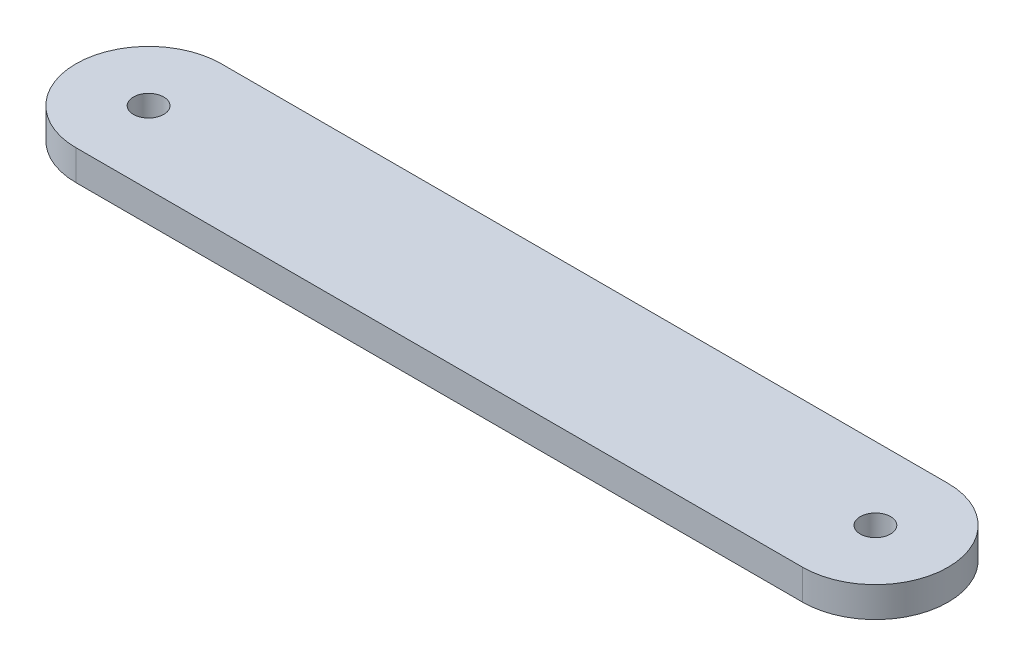
ISO-10303-21;
HEADER;
FILE_DESCRIPTION(('STEP AP214'),'2;1');
FILE_NAME('part.step','',(''),(''),'','','');
FILE_SCHEMA(('AUTOMOTIVE_DESIGN { 1 0 10303 214 1 1 1 1 }'));
ENDSEC;
DATA;
#1=APPLICATION_CONTEXT('core data for automotive mechanical design processes');
#2=APPLICATION_PROTOCOL_DEFINITION('international standard','automotive_design',2000,#1);
#3=PRODUCT_CONTEXT('',#1,'mechanical');
#4=PRODUCT('Part','Part','',(#3));
#5=PRODUCT_RELATED_PRODUCT_CATEGORY('part','',(#4));
#6=PRODUCT_DEFINITION_FORMATION('','',#4);
#7=PRODUCT_DEFINITION_CONTEXT('part definition',#1,'design');
#8=PRODUCT_DEFINITION('design','',#6,#7);
#9=PRODUCT_DEFINITION_SHAPE('','',#8);
#10=(LENGTH_UNIT() NAMED_UNIT(*) SI_UNIT(.MILLI.,.METRE.));
#11=(NAMED_UNIT(*) PLANE_ANGLE_UNIT() SI_UNIT($,.RADIAN.));
#12=(NAMED_UNIT(*) SI_UNIT($,.STERADIAN.) SOLID_ANGLE_UNIT());
#13=UNCERTAINTY_MEASURE_WITH_UNIT(LENGTH_MEASURE(1.E-05),#10,'distance_accuracy_value','');
#14=(GEOMETRIC_REPRESENTATION_CONTEXT(3) GLOBAL_UNCERTAINTY_ASSIGNED_CONTEXT((#13)) GLOBAL_UNIT_ASSIGNED_CONTEXT((#10,
#11,#12)) REPRESENTATION_CONTEXT('',''));
#15=CARTESIAN_POINT('',(0.,0.,0.));
#16=DIRECTION('',(0.,0.,1.));
#17=DIRECTION('',(1.,0.,0.));
#18=AXIS2_PLACEMENT_3D('',#15,#16,#17);
#19=CARTESIAN_POINT('',(0.,5.,1.82223204462739));
#20=DIRECTION('',(0.,1.,0.));
#21=DIRECTION('',(0.,0.,1.));
#22=AXIS2_PLACEMENT_3D('',#19,#20,#21);
#23=PLANE('',#22);
#24=CARTESIAN_POINT('',(0.,5.,1.82223204462739));
#25=DIRECTION('',(0.,1.,0.));
#26=DIRECTION('',(0.,0.,1.));
#27=AXIS2_PLACEMENT_3D('',#24,#25,#26);
#28=CIRCLE('',#27,2.5);
#29=CARTESIAN_POINT('',(0.,5.,4.32223204462739));
#30=VERTEX_POINT('',#29);
#31=EDGE_CURVE('E99',#30,#30,#28,.T.);
#32=ORIENTED_EDGE('',*,*,#31,.F.);
#33=EDGE_LOOP('',(#32));
#34=FACE_BOUND('',#33,.T.);
#35=CARTESIAN_POINT('',(0.,5.,1.82223204462739));
#36=DIRECTION('',(0.,1.,0.));
#37=DIRECTION('',(0.,0.,1.));
#38=AXIS2_PLACEMENT_3D('',#35,#36,#37);
#39=CIRCLE('',#38,12.);
#40=CARTESIAN_POINT('',(0.,5.,-10.1777679553726));
#41=VERTEX_POINT('',#40);
#42=CARTESIAN_POINT('',(0.,5.,13.8222320446274));
#43=VERTEX_POINT('',#42);
#44=EDGE_CURVE('E84',#41,#43,#39,.T.);
#45=ORIENTED_EDGE('',*,*,#44,.T.);
#46=DIRECTION('',(1.,0.,0.));
#47=VECTOR('',#46,1.);
#48=CARTESIAN_POINT('',(0.,5.,13.8222320446274));
#49=LINE('',#48,#47);
#50=CARTESIAN_POINT('',(120.,5.,13.8222320446274));
#51=VERTEX_POINT('',#50);
#52=EDGE_CURVE('E79',#43,#51,#49,.T.);
#53=ORIENTED_EDGE('',*,*,#52,.T.);
#54=CARTESIAN_POINT('',(120.,5.,1.82223204462739));
#55=DIRECTION('',(0.,1.,0.));
#56=DIRECTION('',(0.,0.,1.));
#57=AXIS2_PLACEMENT_3D('',#54,#55,#56);
#58=CIRCLE('',#57,12.);
#59=CARTESIAN_POINT('',(120.,5.,-10.1777679553726));
#60=VERTEX_POINT('',#59);
#61=EDGE_CURVE('E82',#51,#60,#58,.T.);
#62=ORIENTED_EDGE('',*,*,#61,.T.);
#63=DIRECTION('',(-1.,0.,0.));
#64=VECTOR('',#63,1.);
#65=CARTESIAN_POINT('',(0.,5.,-10.1777679553726));
#66=LINE('',#65,#64);
#67=EDGE_CURVE('E49',#60,#41,#66,.T.);
#68=ORIENTED_EDGE('',*,*,#67,.T.);
#69=EDGE_LOOP('',(#45,#53,#62,#68));
#70=FACE_BOUND('',#69,.T.);
#71=CARTESIAN_POINT('',(120.,5.,1.82223204462739));
#72=DIRECTION('',(0.,1.,0.));
#73=DIRECTION('',(0.,0.,1.));
#74=AXIS2_PLACEMENT_3D('',#71,#72,#73);
#75=CIRCLE('',#74,2.49999999999999);
#76=CARTESIAN_POINT('',(120.,5.,4.32223204462739));
#77=VERTEX_POINT('',#76);
#78=EDGE_CURVE('E114',#77,#77,#75,.T.);
#79=ORIENTED_EDGE('',*,*,#78,.F.);
#80=EDGE_LOOP('',(#79));
#81=FACE_BOUND('',#80,.T.);
#82=ADVANCED_FACE('F32',(#34,#70,#81),#23,.T.);
#83=CARTESIAN_POINT('',(0.,0.,1.82223204462739));
#84=DIRECTION('',(0.,1.,0.));
#85=DIRECTION('',(0.,0.,1.));
#86=AXIS2_PLACEMENT_3D('',#83,#84,#85);
#87=PLANE('',#86);
#88=CARTESIAN_POINT('',(0.,0.,1.82223204462739));
#89=DIRECTION('',(0.,1.,0.));
#90=DIRECTION('',(0.,0.,1.));
#91=AXIS2_PLACEMENT_3D('',#88,#89,#90);
#92=CIRCLE('',#91,2.5);
#93=CARTESIAN_POINT('',(0.,0.,4.32223204462739));
#94=VERTEX_POINT('',#93);
#95=EDGE_CURVE('E111',#94,#94,#92,.T.);
#96=ORIENTED_EDGE('',*,*,#95,.T.);
#97=EDGE_LOOP('',(#96));
#98=FACE_BOUND('',#97,.T.);
#99=CARTESIAN_POINT('',(0.,0.,1.82223204462739));
#100=DIRECTION('',(0.,1.,0.));
#101=DIRECTION('',(0.,0.,1.));
#102=AXIS2_PLACEMENT_3D('',#99,#100,#101);
#103=CIRCLE('',#102,12.);
#104=CARTESIAN_POINT('',(0.,0.,-10.1777679553726));
#105=VERTEX_POINT('',#104);
#106=CARTESIAN_POINT('',(0.,0.,13.8222320446274));
#107=VERTEX_POINT('',#106);
#108=EDGE_CURVE('E96',#105,#107,#103,.T.);
#109=ORIENTED_EDGE('',*,*,#108,.F.);
#110=DIRECTION('',(-1.,0.,0.));
#111=VECTOR('',#110,1.);
#112=CARTESIAN_POINT('',(0.,0.,-10.1777679553726));
#113=LINE('',#112,#111);
#114=CARTESIAN_POINT('',(120.,0.,-10.1777679553726));
#115=VERTEX_POINT('',#114);
#116=EDGE_CURVE('E72',#115,#105,#113,.T.);
#117=ORIENTED_EDGE('',*,*,#116,.F.);
#118=CARTESIAN_POINT('',(120.,0.,1.82223204462739));
#119=DIRECTION('',(0.,1.,0.));
#120=DIRECTION('',(0.,0.,1.));
#121=AXIS2_PLACEMENT_3D('',#118,#119,#120);
#122=CIRCLE('',#121,12.);
#123=CARTESIAN_POINT('',(120.,0.,13.8222320446274));
#124=VERTEX_POINT('',#123);
#125=EDGE_CURVE('E66',#124,#115,#122,.T.);
#126=ORIENTED_EDGE('',*,*,#125,.F.);
#127=DIRECTION('',(1.,0.,0.));
#128=VECTOR('',#127,1.);
#129=CARTESIAN_POINT('',(0.,0.,13.8222320446274));
#130=LINE('',#129,#128);
#131=EDGE_CURVE('E88',#107,#124,#130,.T.);
#132=ORIENTED_EDGE('',*,*,#131,.F.);
#133=EDGE_LOOP('',(#109,#117,#126,#132));
#134=FACE_BOUND('',#133,.T.);
#135=CARTESIAN_POINT('',(120.,0.,1.82223204462739));
#136=DIRECTION('',(0.,1.,0.));
#137=DIRECTION('',(0.,0.,1.));
#138=AXIS2_PLACEMENT_3D('',#135,#136,#137);
#139=CIRCLE('',#138,2.49999999999999);
#140=CARTESIAN_POINT('',(120.,0.,4.32223204462739));
#141=VERTEX_POINT('',#140);
#142=EDGE_CURVE('E117',#141,#141,#139,.T.);
#143=ORIENTED_EDGE('',*,*,#142,.T.);
#144=EDGE_LOOP('',(#143));
#145=FACE_BOUND('',#144,.T.);
#146=ADVANCED_FACE('F107',(#98,#134,#145),#87,.F.);
#147=CARTESIAN_POINT('',(0.,5.,1.82223204462739));
#148=DIRECTION('',(0.,-1.,0.));
#149=DIRECTION('',(0.,0.,-1.));
#150=AXIS2_PLACEMENT_3D('',#147,#148,#149);
#151=CYLINDRICAL_SURFACE('',#150,12.);
#152=ORIENTED_EDGE('',*,*,#108,.T.);
#153=DIRECTION('',(0.,-1.,0.));
#154=VECTOR('',#153,1.);
#155=CARTESIAN_POINT('',(0.,5.,13.8222320446274));
#156=LINE('',#155,#154);
#157=EDGE_CURVE('E11',#43,#107,#156,.T.);
#158=ORIENTED_EDGE('',*,*,#157,.F.);
#159=ORIENTED_EDGE('',*,*,#44,.F.);
#160=DIRECTION('',(0.,-1.,0.));
#161=VECTOR('',#160,1.);
#162=CARTESIAN_POINT('',(0.,5.,-10.1777679553726));
#163=LINE('',#162,#161);
#164=EDGE_CURVE('E92',#41,#105,#163,.T.);
#165=ORIENTED_EDGE('',*,*,#164,.T.);
#166=EDGE_LOOP('',(#152,#158,#159,#165));
#167=FACE_BOUND('',#166,.T.);
#168=ADVANCED_FACE('F34',(#167),#151,.T.);
#169=CARTESIAN_POINT('',(0.,5.,13.8222320446274));
#170=DIRECTION('',(0.,0.,-1.));
#171=DIRECTION('',(-1.,0.,0.));
#172=AXIS2_PLACEMENT_3D('',#169,#170,#171);
#173=PLANE('',#172);
#174=ORIENTED_EDGE('',*,*,#131,.T.);
#175=DIRECTION('',(0.,-1.,0.));
#176=VECTOR('',#175,1.);
#177=CARTESIAN_POINT('',(120.,5.,13.8222320446274));
#178=LINE('',#177,#176);
#179=EDGE_CURVE('E41',#51,#124,#178,.T.);
#180=ORIENTED_EDGE('',*,*,#179,.F.);
#181=ORIENTED_EDGE('',*,*,#52,.F.);
#182=ORIENTED_EDGE('',*,*,#157,.T.);
#183=EDGE_LOOP('',(#174,#180,#181,#182));
#184=FACE_BOUND('',#183,.T.);
#185=ADVANCED_FACE('F87',(#184),#173,.F.);
#186=CARTESIAN_POINT('',(120.,5.,1.82223204462739));
#187=DIRECTION('',(0.,-1.,0.));
#188=DIRECTION('',(0.,0.,-1.));
#189=AXIS2_PLACEMENT_3D('',#186,#187,#188);
#190=CYLINDRICAL_SURFACE('',#189,12.);
#191=ORIENTED_EDGE('',*,*,#125,.T.);
#192=DIRECTION('',(0.,-1.,0.));
#193=VECTOR('',#192,1.);
#194=CARTESIAN_POINT('',(120.,5.,-10.1777679553726));
#195=LINE('',#194,#193);
#196=EDGE_CURVE('E89',#60,#115,#195,.T.);
#197=ORIENTED_EDGE('',*,*,#196,.F.);
#198=ORIENTED_EDGE('',*,*,#61,.F.);
#199=ORIENTED_EDGE('',*,*,#179,.T.);
#200=EDGE_LOOP('',(#191,#197,#198,#199));
#201=FACE_BOUND('',#200,.T.);
#202=ADVANCED_FACE('F90',(#201),#190,.T.);
#203=CARTESIAN_POINT('',(0.,5.,-10.1777679553726));
#204=DIRECTION('',(0.,0.,1.));
#205=DIRECTION('',(1.,0.,0.));
#206=AXIS2_PLACEMENT_3D('',#203,#204,#205);
#207=PLANE('',#206);
#208=ORIENTED_EDGE('',*,*,#116,.T.);
#209=ORIENTED_EDGE('',*,*,#164,.F.);
#210=ORIENTED_EDGE('',*,*,#67,.F.);
#211=ORIENTED_EDGE('',*,*,#196,.T.);
#212=EDGE_LOOP('',(#208,#209,#210,#211));
#213=FACE_BOUND('',#212,.T.);
#214=ADVANCED_FACE('F104',(#213),#207,.F.);
#215=CARTESIAN_POINT('',(0.,5.,1.82223204462739));
#216=DIRECTION('',(0.,-1.,0.));
#217=DIRECTION('',(0.,0.,-1.));
#218=AXIS2_PLACEMENT_3D('',#215,#216,#217);
#219=CYLINDRICAL_SURFACE('',#218,2.5);
#220=ORIENTED_EDGE('',*,*,#31,.T.);
#221=EDGE_LOOP('',(#220));
#222=FACE_BOUND('',#221,.T.);
#223=ORIENTED_EDGE('',*,*,#95,.F.);
#224=EDGE_LOOP('',(#223));
#225=FACE_BOUND('',#224,.T.);
#226=ADVANCED_FACE('F135',(#222,#225),#219,.F.);
#227=CARTESIAN_POINT('',(120.,5.,1.82223204462739));
#228=DIRECTION('',(0.,-1.,0.));
#229=DIRECTION('',(0.,0.,-1.));
#230=AXIS2_PLACEMENT_3D('',#227,#228,#229);
#231=CYLINDRICAL_SURFACE('',#230,2.49999999999999);
#232=ORIENTED_EDGE('',*,*,#78,.T.);
#233=EDGE_LOOP('',(#232));
#234=FACE_BOUND('',#233,.T.);
#235=ORIENTED_EDGE('',*,*,#142,.F.);
#236=EDGE_LOOP('',(#235));
#237=FACE_BOUND('',#236,.T.);
#238=ADVANCED_FACE('F123',(#234,#237),#231,.F.);
#239=CLOSED_SHELL('',(#82,#146,#168,#185,#202,#214,#226,#238));
#240=MANIFOLD_SOLID_BREP('B2',#239);
#241=ADVANCED_BREP_SHAPE_REPRESENTATION('',(#18,#240),#14);
#242=SHAPE_DEFINITION_REPRESENTATION(#9,#241);
ENDSEC;
END-ISO-10303-21;
